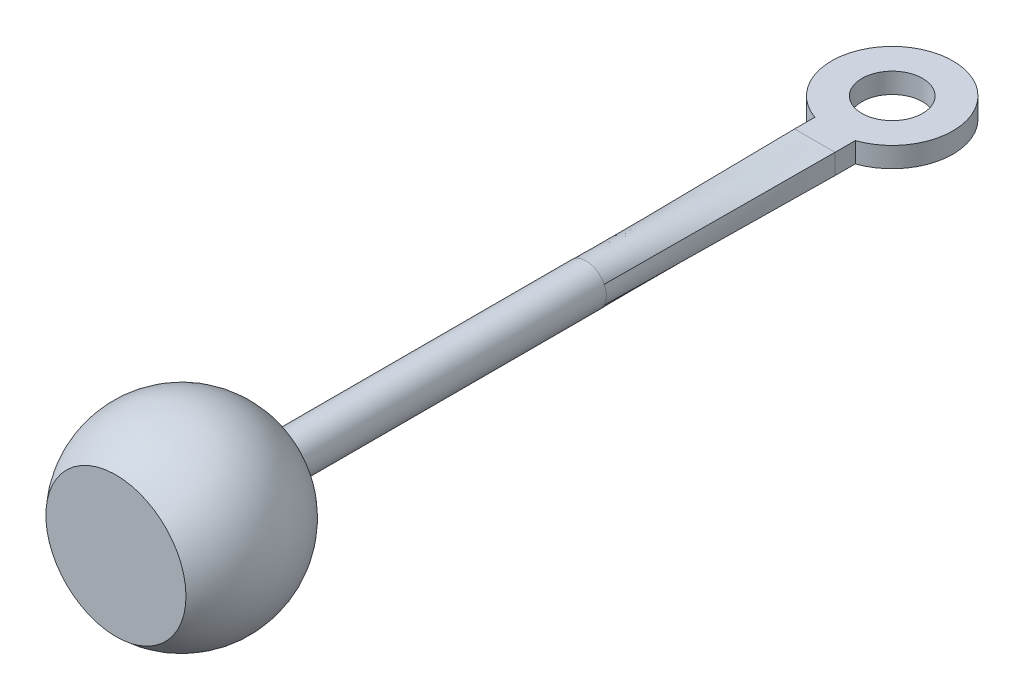
ISO-10303-21;
HEADER;
FILE_DESCRIPTION(('STEP AP214'),'2;1');
FILE_NAME('part.step','',(''),(''),'','','');
FILE_SCHEMA(('AUTOMOTIVE_DESIGN { 1 0 10303 214 1 1 1 1 }'));
ENDSEC;
DATA;
#1=APPLICATION_CONTEXT('core data for automotive mechanical design processes');
#2=APPLICATION_PROTOCOL_DEFINITION('international standard','automotive_design',2000,#1);
#3=PRODUCT_CONTEXT('',#1,'mechanical');
#4=PRODUCT('Part','Part','',(#3));
#5=PRODUCT_RELATED_PRODUCT_CATEGORY('part','',(#4));
#6=PRODUCT_DEFINITION_FORMATION('','',#4);
#7=PRODUCT_DEFINITION_CONTEXT('part definition',#1,'design');
#8=PRODUCT_DEFINITION('design','',#6,#7);
#9=PRODUCT_DEFINITION_SHAPE('','',#8);
#10=(LENGTH_UNIT() NAMED_UNIT(*) SI_UNIT(.MILLI.,.METRE.));
#11=(NAMED_UNIT(*) PLANE_ANGLE_UNIT() SI_UNIT($,.RADIAN.));
#12=(NAMED_UNIT(*) SI_UNIT($,.STERADIAN.) SOLID_ANGLE_UNIT());
#13=UNCERTAINTY_MEASURE_WITH_UNIT(LENGTH_MEASURE(1.E-05),#10,'distance_accuracy_value','');
#14=(GEOMETRIC_REPRESENTATION_CONTEXT(3) GLOBAL_UNCERTAINTY_ASSIGNED_CONTEXT((#13)) GLOBAL_UNIT_ASSIGNED_CONTEXT((#10,
#11,#12)) REPRESENTATION_CONTEXT('',''));
#15=CARTESIAN_POINT('',(0.,0.,0.));
#16=DIRECTION('',(0.,0.,1.));
#17=DIRECTION('',(1.,0.,0.));
#18=AXIS2_PLACEMENT_3D('',#15,#16,#17);
#19=CARTESIAN_POINT('',(0.,0.,40.));
#20=DIRECTION('',(-1.,0.,0.));
#21=DIRECTION('',(0.,0.,-1.));
#22=AXIS2_PLACEMENT_3D('',#19,#20,#21);
#23=SPHERICAL_SURFACE('',#22,9.5);
#24=CARTESIAN_POINT('',(0.,0.,40.));
#25=DIRECTION('',(0.,0.,1.));
#26=DIRECTION('',(1.,0.,0.));
#27=AXIS2_PLACEMENT_3D('',#24,#25,#26);
#28=SPHERICAL_SURFACE('',#27,9.5);
#29=CARTESIAN_POINT('',(0.,0.,30.7129121894966));
#30=DIRECTION('',(0.,0.,1.));
#31=DIRECTION('',(1.,0.,0.));
#32=AXIS2_PLACEMENT_3D('',#29,#30,#31);
#33=CIRCLE('',#32,2.);
#34=CARTESIAN_POINT('',(2.,0.,30.7129121894966));
#35=VERTEX_POINT('',#34);
#36=EDGE_CURVE('E12',#35,#35,#33,.T.);
#37=ORIENTED_EDGE('',*,*,#36,.T.);
#38=EDGE_LOOP('',(#37));
#39=FACE_BOUND('',#38,.T.);
#40=CARTESIAN_POINT('',(0.,0.,46.5));
#41=DIRECTION('',(0.,0.,1.));
#42=DIRECTION('',(1.,0.,0.));
#43=AXIS2_PLACEMENT_3D('',#40,#41,#42);
#44=CIRCLE('',#43,6.92820323027551);
#45=CARTESIAN_POINT('',(6.92820323027551,0.,46.5));
#46=VERTEX_POINT('',#45);
#47=EDGE_CURVE('E136',#46,#46,#44,.T.);
#48=ORIENTED_EDGE('',*,*,#47,.F.);
#49=EDGE_LOOP('',(#48));
#50=FACE_BOUND('',#49,.T.);
#51=ADVANCED_FACE('F63',(#39,#50),#28,.T.);
#52=CARTESIAN_POINT('',(0.,0.,40.));
#53=DIRECTION('',(0.,0.,-1.));
#54=DIRECTION('',(-1.,0.,0.));
#55=AXIS2_PLACEMENT_3D('',#52,#53,#54);
#56=CYLINDRICAL_SURFACE('',#55,2.);
#57=ORIENTED_EDGE('',*,*,#36,.F.);
#58=EDGE_LOOP('',(#57));
#59=FACE_BOUND('',#58,.T.);
#60=CARTESIAN_POINT('',(-1.78885438199983,0.894427190999916,0.));
#61=CARTESIAN_POINT('',(-1.72218771533317,1.02776052433325,0.));
#62=CARTESIAN_POINT('',(-1.63578593645119,1.16316836663363,0.));
#63=CARTESIAN_POINT('',(-1.41659582297631,1.42197487789157,0.));
#64=CARTESIAN_POINT('',(-1.28359209116711,1.54523641285764,0.));
#65=CARTESIAN_POINT('',(-0.973053395039501,1.757421781625,0.));
#66=CARTESIAN_POINT('',(-0.795448843726478,1.84600806153898,0.));
#67=CARTESIAN_POINT('',(-0.411798664076613,1.96746194029704,0.));
#68=CARTESIAN_POINT('',(-0.206011329583298,2.,0.));
#69=CARTESIAN_POINT('',(0.206011329583298,2.,0.));
#70=CARTESIAN_POINT('',(0.411798664076613,1.96746194029704,0.));
#71=CARTESIAN_POINT('',(0.795448843726478,1.84600806153898,0.));
#72=CARTESIAN_POINT('',(0.973053395039501,1.757421781625,0.));
#73=CARTESIAN_POINT('',(1.28359209116711,1.54523641285764,0.));
#74=CARTESIAN_POINT('',(1.41659582297631,1.42197487789157,0.));
#75=CARTESIAN_POINT('',(1.63578593645119,1.16316836663363,0.));
#76=CARTESIAN_POINT('',(1.72218771533317,1.02776052433325,0.));
#77=CARTESIAN_POINT('',(1.78885438199983,0.894427190999916,0.));
#78=B_SPLINE_CURVE_WITH_KNOTS('',3,(#60,#61,#62,#63,#64,#65,#66,#67,#68,#69,#70,#71,#72,#73,#74,
#75,#76,#77),.UNSPECIFIED.,.F.,.F.,(4,2,2,2,2,2,2,2,4),(0.,0.125,0.25,0.375,0.5,0.625,0.75,
0.875,1.),.UNSPECIFIED.);
#79=CARTESIAN_POINT('',(1.78890348843405,0.894451571388587,0.));
#80=VERTEX_POINT('',#79);
#81=CARTESIAN_POINT('',(-1.78892220402768,0.894460851714679,0.));
#82=VERTEX_POINT('',#81);
#83=EDGE_CURVE('E74',#80,#82,#78,.F.);
#84=ORIENTED_EDGE('',*,*,#83,.T.);
#85=CARTESIAN_POINT('',(0.,0.,0.));
#86=DIRECTION('',(0.,0.,-1.));
#87=DIRECTION('',(1.,0.,0.));
#88=AXIS2_PLACEMENT_3D('',#85,#86,#87);
#89=CIRCLE('',#88,2.);
#90=CARTESIAN_POINT('',(-1.78890348848276,-0.894451571412763,0.));
#91=VERTEX_POINT('',#90);
#92=EDGE_CURVE('E127',#91,#82,#89,.T.);
#93=ORIENTED_EDGE('',*,*,#92,.F.);
#94=CARTESIAN_POINT('',(0.,0.,0.));
#95=DIRECTION('',(0.,0.,-1.));
#96=DIRECTION('',(1.,0.,0.));
#97=AXIS2_PLACEMENT_3D('',#94,#95,#96);
#98=CIRCLE('',#97,2.);
#99=CARTESIAN_POINT('',(1.78892220395366,-0.894460851677947,0.));
#100=VERTEX_POINT('',#99);
#101=EDGE_CURVE('E109',#100,#91,#98,.T.);
#102=ORIENTED_EDGE('',*,*,#101,.F.);
#103=CARTESIAN_POINT('',(0.,0.,0.));
#104=DIRECTION('',(0.,0.,1.));
#105=DIRECTION('',(1.,0.,0.));
#106=AXIS2_PLACEMENT_3D('',#103,#104,#105);
#107=CIRCLE('',#106,2.);
#108=EDGE_CURVE('E143',#80,#100,#107,.F.);
#109=ORIENTED_EDGE('',*,*,#108,.F.);
#110=EDGE_LOOP('',(#84,#93,#102,#109));
#111=FACE_BOUND('',#110,.T.);
#112=ADVANCED_FACE('F65',(#59,#111),#56,.T.);
#113=CARTESIAN_POINT('',(2.,-1.,-22.62));
#114=CARTESIAN_POINT('',(1.78885438199983,-0.894427190999916,0.));
#115=CARTESIAN_POINT('',(2.,-0.666666666666666,-22.62));
#116=CARTESIAN_POINT('',(1.92218771533317,-0.62776052433325,0.));
#117=CARTESIAN_POINT('',(2.,-0.333333333333333,-22.62));
#118=CARTESIAN_POINT('',(2.,-0.314757303333053,0.));
#119=CARTESIAN_POINT('',(2.,0.333333333333334,-22.62));
#120=CARTESIAN_POINT('',(2.,0.314757303333053,0.));
#121=CARTESIAN_POINT('',(2.,0.666666666666667,-22.62));
#122=CARTESIAN_POINT('',(1.92218771533317,0.627760524333249,0.));
#123=CARTESIAN_POINT('',(2.,1.,-22.62));
#124=CARTESIAN_POINT('',(1.78885438199983,0.894427190999916,0.));
#125=B_SPLINE_SURFACE_WITH_KNOTS('',3,1,((#113,#114),(#115,#116),(#117,#118),(#119,#120),(#121,
#122),(#123,#124)),.UNSPECIFIED.,.F.,.F.,.F.,(4,2,4),(2,2),(0.,0.5,1.),(0.,1.),.UNSPECIFIED.);
#126=DIRECTION('',(0.,-1.,0.));
#127=VECTOR('',#126,1.);
#128=CARTESIAN_POINT('',(2.,-1.,-22.62));
#129=LINE('',#128,#127);
#130=CARTESIAN_POINT('',(2.,1.,-22.62));
#131=VERTEX_POINT('',#130);
#132=CARTESIAN_POINT('',(2.,-1.,-22.62));
#133=VERTEX_POINT('',#132);
#134=EDGE_CURVE('E204',#131,#133,#129,.T.);
#135=DIRECTION('',(-0.00933395757928658,-0.00466697878964328,0.999945546789866));
#136=VECTOR('',#135,1.);
#137=CARTESIAN_POINT('',(1.89442719099992,0.947213595499958,-11.31));
#138=LINE('',#137,#136);
#139=EDGE_CURVE('E88',#131,#80,#138,.T.);
#140=DIRECTION('',(0.00933395757928659,-0.00466697878964327,-0.999945546789866));
#141=VECTOR('',#140,1.);
#142=CARTESIAN_POINT('',(1.89442719099992,-0.947213595499958,-11.31));
#143=LINE('',#142,#141);
#144=EDGE_CURVE('E117',#100,#133,#143,.T.);
#145=ORIENTED_EDGE('',*,*,#134,.F.);
#146=ORIENTED_EDGE('',*,*,#139,.T.);
#147=ORIENTED_EDGE('',*,*,#108,.T.);
#148=ORIENTED_EDGE('',*,*,#144,.T.);
#149=EDGE_LOOP('',(#145,#146,#147,#148));
#150=FACE_BOUND('',#149,.T.);
#151=ADVANCED_FACE('F202',(#150),#125,.T.);
#152=CARTESIAN_POINT('',(2.,1.,-22.62));
#153=CARTESIAN_POINT('',(1.78885438199983,0.894427190999916,0.));
#154=CARTESIAN_POINT('',(1.83333333333333,1.,-22.62));
#155=CARTESIAN_POINT('',(1.72218771533317,1.02776052433325,0.));
#156=CARTESIAN_POINT('',(1.66666666666667,1.,-22.62));
#157=CARTESIAN_POINT('',(1.63578593645119,1.16316836663363,0.));
#158=CARTESIAN_POINT('',(1.33333333333333,1.,-22.62));
#159=CARTESIAN_POINT('',(1.41659582297631,1.42197487789157,0.));
#160=CARTESIAN_POINT('',(1.16666666666667,1.,-22.62));
#161=CARTESIAN_POINT('',(1.28359209116711,1.54523641285764,0.));
#162=CARTESIAN_POINT('',(0.833333333333332,1.,-22.62));
#163=CARTESIAN_POINT('',(0.973053395039501,1.757421781625,0.));
#164=CARTESIAN_POINT('',(0.666666666666666,1.,-22.62));
#165=CARTESIAN_POINT('',(0.795448843726478,1.84600806153898,0.));
#166=CARTESIAN_POINT('',(0.333333333333332,1.,-22.62));
#167=CARTESIAN_POINT('',(0.411798664076613,1.96746194029704,0.));
#168=CARTESIAN_POINT('',(0.166666666666665,1.,-22.62));
#169=CARTESIAN_POINT('',(0.206011329583298,2.,0.));
#170=CARTESIAN_POINT('',(-0.166666666666668,1.,-22.62));
#171=CARTESIAN_POINT('',(-0.206011329583298,2.,0.));
#172=CARTESIAN_POINT('',(-0.333333333333335,1.,-22.62));
#173=CARTESIAN_POINT('',(-0.411798664076613,1.96746194029704,0.));
#174=CARTESIAN_POINT('',(-0.666666666666668,1.,-22.62));
#175=CARTESIAN_POINT('',(-0.795448843726478,1.84600806153898,0.));
#176=CARTESIAN_POINT('',(-0.833333333333335,1.,-22.62));
#177=CARTESIAN_POINT('',(-0.973053395039501,1.757421781625,0.));
#178=CARTESIAN_POINT('',(-1.16666666666667,1.,-22.62));
#179=CARTESIAN_POINT('',(-1.28359209116711,1.54523641285764,0.));
#180=CARTESIAN_POINT('',(-1.33333333333333,1.,-22.62));
#181=CARTESIAN_POINT('',(-1.41659582297631,1.42197487789157,0.));
#182=CARTESIAN_POINT('',(-1.66666666666667,1.,-22.62));
#183=CARTESIAN_POINT('',(-1.63578593645119,1.16316836663363,0.));
#184=CARTESIAN_POINT('',(-1.83333333333333,1.,-22.62));
#185=CARTESIAN_POINT('',(-1.72218771533317,1.02776052433325,0.));
#186=CARTESIAN_POINT('',(-2.,1.,-22.62));
#187=CARTESIAN_POINT('',(-1.78885438199983,0.894427190999916,0.));
#188=B_SPLINE_SURFACE_WITH_KNOTS('',3,1,((#152,#153),(#154,#155),(#156,#157),(#158,#159),(#160,
#161),(#162,#163),(#164,#165),(#166,#167),(#168,#169),(#170,#171),(#172,#173),(#174,#175),(#176,
#177),(#178,#179),(#180,#181),(#182,#183),(#184,#185),(#186,#187)),.UNSPECIFIED.,.F.,.F.,.F.,(4,
2,2,2,2,2,2,2,4),(2,2),(0.,0.125,0.25,0.375,0.5,0.625,0.75,0.875,1.),(0.,1.),.UNSPECIFIED.);
#189=DIRECTION('',(1.,0.,0.));
#190=VECTOR('',#189,1.);
#191=CARTESIAN_POINT('',(2.,1.,-22.62));
#192=LINE('',#191,#190);
#193=CARTESIAN_POINT('',(-2.,1.,-22.62));
#194=VERTEX_POINT('',#193);
#195=EDGE_CURVE('E215',#194,#131,#192,.T.);
#196=DIRECTION('',(0.00933395757928657,-0.00466697878964329,0.999945546789866));
#197=VECTOR('',#196,1.);
#198=CARTESIAN_POINT('',(-1.89442719099992,0.947213595499958,-11.31));
#199=LINE('',#198,#197);
#200=EDGE_CURVE('E82',#194,#82,#199,.T.);
#201=ORIENTED_EDGE('',*,*,#195,.F.);
#202=ORIENTED_EDGE('',*,*,#200,.T.);
#203=ORIENTED_EDGE('',*,*,#83,.F.);
#204=ORIENTED_EDGE('',*,*,#139,.F.);
#205=EDGE_LOOP('',(#201,#202,#203,#204));
#206=FACE_BOUND('',#205,.T.);
#207=ADVANCED_FACE('F219',(#206),#188,.T.);
#208=CARTESIAN_POINT('',(-2.,-1.,-22.62));
#209=CARTESIAN_POINT('',(-1.78885438199983,-0.894427190999916,0.));
#210=CARTESIAN_POINT('',(-1.83333333333333,-1.,-22.62));
#211=CARTESIAN_POINT('',(-1.72218771533317,-1.02776052433325,0.));
#212=CARTESIAN_POINT('',(-1.66666666666667,-1.,-22.62));
#213=CARTESIAN_POINT('',(-1.63578593645119,-1.16316836663363,0.));
#214=CARTESIAN_POINT('',(-1.33333333333333,-1.,-22.62));
#215=CARTESIAN_POINT('',(-1.41659582297631,-1.42197487789157,0.));
#216=CARTESIAN_POINT('',(-1.16666666666667,-1.,-22.62));
#217=CARTESIAN_POINT('',(-1.28359209116711,-1.54523641285764,0.));
#218=CARTESIAN_POINT('',(-0.833333333333332,-1.,-22.62));
#219=CARTESIAN_POINT('',(-0.973053395039501,-1.757421781625,0.));
#220=CARTESIAN_POINT('',(-0.666666666666666,-1.,-22.62));
#221=CARTESIAN_POINT('',(-0.795448843726479,-1.84600806153898,0.));
#222=CARTESIAN_POINT('',(-0.333333333333332,-1.,-22.62));
#223=CARTESIAN_POINT('',(-0.411798664076613,-1.96746194029704,0.));
#224=CARTESIAN_POINT('',(-0.166666666666665,-1.,-22.62));
#225=CARTESIAN_POINT('',(-0.206011329583299,-2.,0.));
#226=CARTESIAN_POINT('',(0.166666666666668,-1.,-22.62));
#227=CARTESIAN_POINT('',(0.206011329583298,-2.,0.));
#228=CARTESIAN_POINT('',(0.333333333333335,-1.,-22.62));
#229=CARTESIAN_POINT('',(0.411798664076612,-1.96746194029704,0.));
#230=CARTESIAN_POINT('',(0.666666666666668,-1.,-22.62));
#231=CARTESIAN_POINT('',(0.795448843726478,-1.84600806153898,0.));
#232=CARTESIAN_POINT('',(0.833333333333335,-1.,-22.62));
#233=CARTESIAN_POINT('',(0.9730533950395,-1.757421781625,0.));
#234=CARTESIAN_POINT('',(1.16666666666667,-1.,-22.62));
#235=CARTESIAN_POINT('',(1.28359209116711,-1.54523641285764,0.));
#236=CARTESIAN_POINT('',(1.33333333333333,-1.,-22.62));
#237=CARTESIAN_POINT('',(1.41659582297631,-1.42197487789157,0.));
#238=CARTESIAN_POINT('',(1.66666666666667,-1.,-22.62));
#239=CARTESIAN_POINT('',(1.63578593645119,-1.16316836663363,0.));
#240=CARTESIAN_POINT('',(1.83333333333333,-1.,-22.62));
#241=CARTESIAN_POINT('',(1.72218771533317,-1.02776052433325,0.));
#242=CARTESIAN_POINT('',(2.,-1.,-22.62));
#243=CARTESIAN_POINT('',(1.78885438199983,-0.894427190999916,0.));
#244=B_SPLINE_SURFACE_WITH_KNOTS('',3,1,((#208,#209),(#210,#211),(#212,#213),(#214,#215),(#216,
#217),(#218,#219),(#220,#221),(#222,#223),(#224,#225),(#226,#227),(#228,#229),(#230,#231),(#232,
#233),(#234,#235),(#236,#237),(#238,#239),(#240,#241),(#242,#243)),.UNSPECIFIED.,.F.,.F.,.F.,(4,
2,2,2,2,2,2,2,4),(2,2),(0.,0.125,0.25,0.375,0.5,0.625,0.75,0.875,1.),(0.,1.),.UNSPECIFIED.);
#245=DIRECTION('',(-1.,0.,0.));
#246=VECTOR('',#245,1.);
#247=CARTESIAN_POINT('',(2.,-1.,-22.62));
#248=LINE('',#247,#246);
#249=CARTESIAN_POINT('',(-2.,-1.,-22.62));
#250=VERTEX_POINT('',#249);
#251=EDGE_CURVE('E68',#133,#250,#248,.T.);
#252=DIRECTION('',(0.00933395757928657,0.00466697878964329,0.999945546789866));
#253=VECTOR('',#252,1.);
#254=CARTESIAN_POINT('',(-1.89442719099992,-0.947213595499958,-11.31));
#255=LINE('',#254,#253);
#256=EDGE_CURVE('E114',#250,#91,#255,.T.);
#257=ORIENTED_EDGE('',*,*,#251,.F.);
#258=ORIENTED_EDGE('',*,*,#144,.F.);
#259=ORIENTED_EDGE('',*,*,#101,.T.);
#260=ORIENTED_EDGE('',*,*,#256,.F.);
#261=EDGE_LOOP('',(#257,#258,#259,#260));
#262=FACE_BOUND('',#261,.T.);
#263=ADVANCED_FACE('F113',(#262),#244,.T.);
#264=CARTESIAN_POINT('',(-2.,1.,-22.62));
#265=CARTESIAN_POINT('',(-1.78885438199983,0.894427190999916,0.));
#266=CARTESIAN_POINT('',(-2.,0.666666666666666,-22.62));
#267=CARTESIAN_POINT('',(-1.92218771533317,0.627760524333249,0.));
#268=CARTESIAN_POINT('',(-2.,0.333333333333333,-22.62));
#269=CARTESIAN_POINT('',(-2.,0.314757303333053,0.));
#270=CARTESIAN_POINT('',(-2.,-0.333333333333334,-22.62));
#271=CARTESIAN_POINT('',(-2.,-0.314757303333053,0.));
#272=CARTESIAN_POINT('',(-2.,-0.666666666666667,-22.62));
#273=CARTESIAN_POINT('',(-1.92218771533317,-0.627760524333249,0.));
#274=CARTESIAN_POINT('',(-2.,-1.,-22.62));
#275=CARTESIAN_POINT('',(-1.78885438199983,-0.894427190999916,0.));
#276=B_SPLINE_SURFACE_WITH_KNOTS('',3,1,((#264,#265),(#266,#267),(#268,#269),(#270,#271),(#272,
#273),(#274,#275)),.UNSPECIFIED.,.F.,.F.,.F.,(4,2,4),(2,2),(0.,0.5,1.),(0.,1.),.UNSPECIFIED.);
#277=DIRECTION('',(0.,1.,0.));
#278=VECTOR('',#277,1.);
#279=CARTESIAN_POINT('',(-2.,1.,-22.62));
#280=LINE('',#279,#278);
#281=EDGE_CURVE('E131',#250,#194,#280,.T.);
#282=ORIENTED_EDGE('',*,*,#281,.F.);
#283=ORIENTED_EDGE('',*,*,#256,.T.);
#284=ORIENTED_EDGE('',*,*,#92,.T.);
#285=ORIENTED_EDGE('',*,*,#200,.F.);
#286=EDGE_LOOP('',(#282,#283,#284,#285));
#287=FACE_BOUND('',#286,.T.);
#288=ADVANCED_FACE('F126',(#287),#276,.T.);
#289=CARTESIAN_POINT('',(0.,-9.5,46.5));
#290=DIRECTION('',(0.,0.,1.));
#291=DIRECTION('',(1.,0.,0.));
#292=AXIS2_PLACEMENT_3D('',#289,#290,#291);
#293=PLANE('',#292);
#294=ORIENTED_EDGE('',*,*,#47,.T.);
#295=EDGE_LOOP('',(#294));
#296=FACE_BOUND('',#295,.T.);
#297=ADVANCED_FACE('F169',(#296),#293,.T.);
#298=CARTESIAN_POINT('',(2.,1.,-24.62));
#299=DIRECTION('',(-1.,0.,0.));
#300=DIRECTION('',(0.,0.,1.));
#301=AXIS2_PLACEMENT_3D('',#298,#299,#300);
#302=PLANE('',#301);
#303=ORIENTED_EDGE('',*,*,#134,.T.);
#304=DIRECTION('',(0.,0.,1.));
#305=VECTOR('',#304,1.);
#306=CARTESIAN_POINT('',(2.,-1.,-24.62));
#307=LINE('',#306,#305);
#308=CARTESIAN_POINT('',(2.,-1.,-24.62));
#309=VERTEX_POINT('',#308);
#310=EDGE_CURVE('E316',#309,#133,#307,.T.);
#311=ORIENTED_EDGE('',*,*,#310,.F.);
#312=DIRECTION('',(0.,-1.,0.));
#313=VECTOR('',#312,1.);
#314=CARTESIAN_POINT('',(2.,1.,-24.62));
#315=LINE('',#314,#313);
#316=CARTESIAN_POINT('',(2.,1.,-24.62));
#317=VERTEX_POINT('',#316);
#318=EDGE_CURVE('E453',#317,#309,#315,.T.);
#319=ORIENTED_EDGE('',*,*,#318,.F.);
#320=DIRECTION('',(0.,0.,1.));
#321=VECTOR('',#320,1.);
#322=CARTESIAN_POINT('',(2.,1.,-24.62));
#323=LINE('',#322,#321);
#324=EDGE_CURVE('E258',#317,#131,#323,.T.);
#325=ORIENTED_EDGE('',*,*,#324,.T.);
#326=EDGE_LOOP('',(#303,#311,#319,#325));
#327=FACE_BOUND('',#326,.T.);
#328=ADVANCED_FACE('F302',(#327),#302,.F.);
#329=CARTESIAN_POINT('',(2.,-1.,-24.62));
#330=DIRECTION('',(0.,1.,0.));
#331=DIRECTION('',(0.,0.,1.));
#332=AXIS2_PLACEMENT_3D('',#329,#330,#331);
#333=PLANE('',#332);
#334=DIRECTION('',(0.,0.,1.));
#335=VECTOR('',#334,1.);
#336=CARTESIAN_POINT('',(-2.,-1.,-24.62));
#337=LINE('',#336,#335);
#338=CARTESIAN_POINT('',(-2.,-1.,-24.62));
#339=VERTEX_POINT('',#338);
#340=EDGE_CURVE('E275',#339,#250,#337,.T.);
#341=ORIENTED_EDGE('',*,*,#340,.F.);
#342=CARTESIAN_POINT('',(0.,-1.,-30.2768542494924));
#343=DIRECTION('',(0.,-1.,0.));
#344=DIRECTION('',(0.,0.,-1.));
#345=AXIS2_PLACEMENT_3D('',#342,#343,#344);
#346=CIRCLE('',#345,6.);
#347=EDGE_CURVE('E446',#339,#309,#346,.T.);
#348=ORIENTED_EDGE('',*,*,#347,.T.);
#349=ORIENTED_EDGE('',*,*,#310,.T.);
#350=ORIENTED_EDGE('',*,*,#251,.T.);
#351=EDGE_LOOP('',(#341,#348,#349,#350));
#352=FACE_BOUND('',#351,.T.);
#353=CARTESIAN_POINT('',(0.,-1.,-30.2768542494924));
#354=DIRECTION('',(0.,-1.,0.));
#355=DIRECTION('',(0.,0.,-1.));
#356=AXIS2_PLACEMENT_3D('',#353,#354,#355);
#357=CIRCLE('',#356,3.);
#358=CARTESIAN_POINT('',(0.,-1.,-33.2768542494924));
#359=VERTEX_POINT('',#358);
#360=EDGE_CURVE('E444',#359,#359,#357,.T.);
#361=ORIENTED_EDGE('',*,*,#360,.F.);
#362=EDGE_LOOP('',(#361));
#363=FACE_BOUND('',#362,.T.);
#364=ADVANCED_FACE('F297',(#352,#363),#333,.F.);
#365=CARTESIAN_POINT('',(-2.,1.,-24.62));
#366=DIRECTION('',(1.,0.,0.));
#367=DIRECTION('',(0.,0.,-1.));
#368=AXIS2_PLACEMENT_3D('',#365,#366,#367);
#369=PLANE('',#368);
#370=ORIENTED_EDGE('',*,*,#281,.T.);
#371=DIRECTION('',(0.,0.,1.));
#372=VECTOR('',#371,1.);
#373=CARTESIAN_POINT('',(-2.,1.,-24.62));
#374=LINE('',#373,#372);
#375=CARTESIAN_POINT('',(-2.,1.,-24.62));
#376=VERTEX_POINT('',#375);
#377=EDGE_CURVE('E272',#376,#194,#374,.T.);
#378=ORIENTED_EDGE('',*,*,#377,.F.);
#379=DIRECTION('',(0.,1.,0.));
#380=VECTOR('',#379,1.);
#381=CARTESIAN_POINT('',(-2.,1.,-24.62));
#382=LINE('',#381,#380);
#383=EDGE_CURVE('E456',#339,#376,#382,.T.);
#384=ORIENTED_EDGE('',*,*,#383,.F.);
#385=ORIENTED_EDGE('',*,*,#340,.T.);
#386=EDGE_LOOP('',(#370,#378,#384,#385));
#387=FACE_BOUND('',#386,.T.);
#388=ADVANCED_FACE('F287',(#387),#369,.F.);
#389=CARTESIAN_POINT('',(2.,1.,-24.62));
#390=DIRECTION('',(0.,-1.,0.));
#391=DIRECTION('',(0.,0.,-1.));
#392=AXIS2_PLACEMENT_3D('',#389,#390,#391);
#393=PLANE('',#392);
#394=ORIENTED_EDGE('',*,*,#324,.F.);
#395=CARTESIAN_POINT('',(0.,1.,-30.2768542494924));
#396=DIRECTION('',(0.,-1.,0.));
#397=DIRECTION('',(0.,0.,-1.));
#398=AXIS2_PLACEMENT_3D('',#395,#396,#397);
#399=CIRCLE('',#398,6.);
#400=EDGE_CURVE('E448',#317,#376,#399,.F.);
#401=ORIENTED_EDGE('',*,*,#400,.T.);
#402=ORIENTED_EDGE('',*,*,#377,.T.);
#403=ORIENTED_EDGE('',*,*,#195,.T.);
#404=EDGE_LOOP('',(#394,#401,#402,#403));
#405=FACE_BOUND('',#404,.T.);
#406=CARTESIAN_POINT('',(0.,1.,-30.2768542494924));
#407=DIRECTION('',(0.,-1.,0.));
#408=DIRECTION('',(0.,0.,-1.));
#409=AXIS2_PLACEMENT_3D('',#406,#407,#408);
#410=CIRCLE('',#409,3.);
#411=CARTESIAN_POINT('',(0.,1.,-33.2768542494924));
#412=VERTEX_POINT('',#411);
#413=EDGE_CURVE('E441',#412,#412,#410,.F.);
#414=ORIENTED_EDGE('',*,*,#413,.F.);
#415=EDGE_LOOP('',(#414));
#416=FACE_BOUND('',#415,.T.);
#417=ADVANCED_FACE('F296',(#405,#416),#393,.F.);
#418=CARTESIAN_POINT('',(0.,17.9705627484771,-30.2768542494924));
#419=DIRECTION('',(0.,-1.,0.));
#420=DIRECTION('',(0.,0.,-1.));
#421=AXIS2_PLACEMENT_3D('',#418,#419,#420);
#422=CYLINDRICAL_SURFACE('',#421,6.);
#423=ORIENTED_EDGE('',*,*,#400,.F.);
#424=ORIENTED_EDGE('',*,*,#318,.T.);
#425=ORIENTED_EDGE('',*,*,#347,.F.);
#426=ORIENTED_EDGE('',*,*,#383,.T.);
#427=EDGE_LOOP('',(#423,#424,#425,#426));
#428=FACE_BOUND('',#427,.T.);
#429=ADVANCED_FACE('F378',(#428),#422,.T.);
#430=CARTESIAN_POINT('',(0.,17.9705627484771,-30.2768542494924));
#431=DIRECTION('',(0.,-1.,0.));
#432=DIRECTION('',(0.,0.,-1.));
#433=AXIS2_PLACEMENT_3D('',#430,#431,#432);
#434=CYLINDRICAL_SURFACE('',#433,3.);
#435=ORIENTED_EDGE('',*,*,#413,.T.);
#436=EDGE_LOOP('',(#435));
#437=FACE_BOUND('',#436,.T.);
#438=ORIENTED_EDGE('',*,*,#360,.T.);
#439=EDGE_LOOP('',(#438));
#440=FACE_BOUND('',#439,.T.);
#441=ADVANCED_FACE('F385',(#437,#440),#434,.F.);
#442=CLOSED_SHELL('',(#51,#112,#151,#207,#263,#288,#297,#328,#364,#388,#417,#429,#441));
#443=MANIFOLD_SOLID_BREP('B2',#442);
#444=ADVANCED_BREP_SHAPE_REPRESENTATION('',(#18,#443),#14);
#445=SHAPE_DEFINITION_REPRESENTATION(#9,#444);
ENDSEC;
END-ISO-10303-21;
